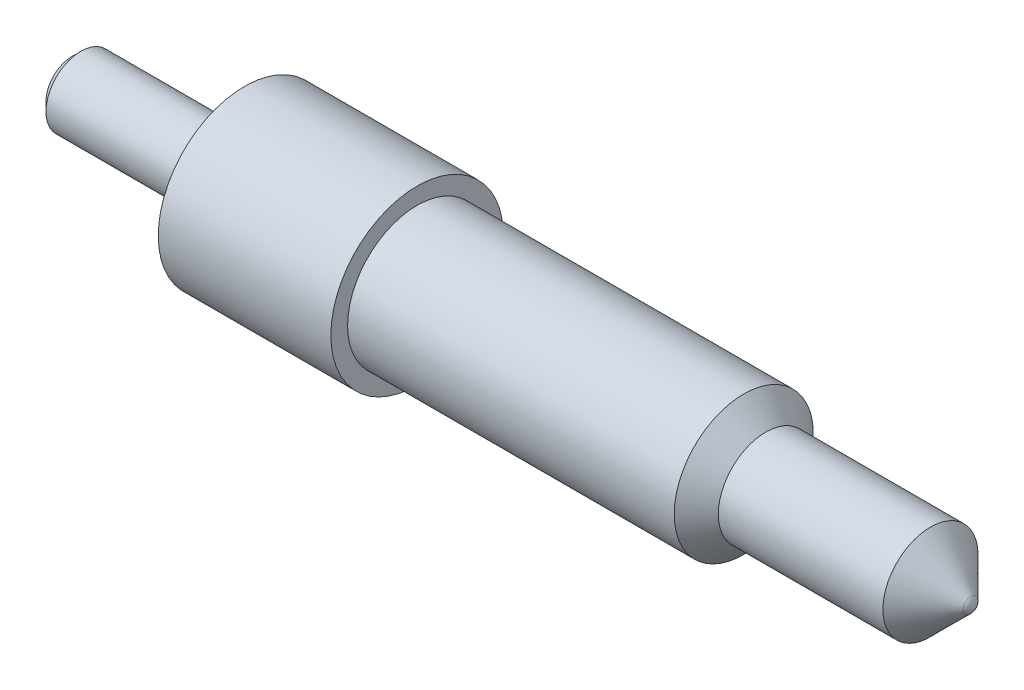
ISO-10303-21;
HEADER;
FILE_DESCRIPTION(('STEP AP214'),'2;1');
FILE_NAME('part.step','',(''),(''),'','','');
FILE_SCHEMA(('AUTOMOTIVE_DESIGN { 1 0 10303 214 1 1 1 1 }'));
ENDSEC;
DATA;
#1=APPLICATION_CONTEXT('core data for automotive mechanical design processes');
#2=APPLICATION_PROTOCOL_DEFINITION('international standard','automotive_design',2000,#1);
#3=PRODUCT_CONTEXT('',#1,'mechanical');
#4=PRODUCT('Part','Part','',(#3));
#5=PRODUCT_RELATED_PRODUCT_CATEGORY('part','',(#4));
#6=PRODUCT_DEFINITION_FORMATION('','',#4);
#7=PRODUCT_DEFINITION_CONTEXT('part definition',#1,'design');
#8=PRODUCT_DEFINITION('design','',#6,#7);
#9=PRODUCT_DEFINITION_SHAPE('','',#8);
#10=(LENGTH_UNIT() NAMED_UNIT(*) SI_UNIT(.MILLI.,.METRE.));
#11=(NAMED_UNIT(*) PLANE_ANGLE_UNIT() SI_UNIT($,.RADIAN.));
#12=(NAMED_UNIT(*) SI_UNIT($,.STERADIAN.) SOLID_ANGLE_UNIT());
#13=UNCERTAINTY_MEASURE_WITH_UNIT(LENGTH_MEASURE(1.E-05),#10,'distance_accuracy_value','');
#14=(GEOMETRIC_REPRESENTATION_CONTEXT(3) GLOBAL_UNCERTAINTY_ASSIGNED_CONTEXT((#13)) GLOBAL_UNIT_ASSIGNED_CONTEXT((#10,
#11,#12)) REPRESENTATION_CONTEXT('',''));
#15=CARTESIAN_POINT('',(0.,0.,0.));
#16=DIRECTION('',(0.,0.,1.));
#17=DIRECTION('',(1.,0.,0.));
#18=AXIS2_PLACEMENT_3D('',#15,#16,#17);
#19=CARTESIAN_POINT('',(12.8524,0.,0.));
#20=DIRECTION('',(-1.,0.,0.));
#21=DIRECTION('',(0.,1.,0.));
#22=AXIS2_PLACEMENT_3D('',#19,#20,#21);
#23=SPHERICAL_SURFACE('',#22,0.152399999999999);
#24=CARTESIAN_POINT('',(12.9601630734528,0.,0.));
#25=DIRECTION('',(-1.,0.,0.));
#26=DIRECTION('',(0.,0.,1.));
#27=AXIS2_PLACEMENT_3D('',#24,#25,#26);
#28=CIRCLE('',#27,0.107763073452829);
#29=CARTESIAN_POINT('',(12.9601630734528,0.,0.107763073452828));
#30=VERTEX_POINT('',#29);
#31=EDGE_CURVE('E10',#30,#30,#28,.T.);
#32=ORIENTED_EDGE('',*,*,#31,.F.);
#33=EDGE_LOOP('',(#32));
#34=FACE_BOUND('',#33,.T.);
#35=ADVANCED_FACE('F29',(#34),#23,.T.);
#36=CARTESIAN_POINT('',(12.9601630734528,0.,0.));
#37=DIRECTION('',(-1.,0.,0.));
#38=DIRECTION('',(0.,0.,1.));
#39=AXIS2_PLACEMENT_3D('',#36,#37,#38);
#40=CONICAL_SURFACE('',#39,0.107763073452829,0.785398163397447);
#41=CARTESIAN_POINT('',(12.3821261469057,0.,0.));
#42=DIRECTION('',(-1.,0.,0.));
#43=DIRECTION('',(0.,0.,1.));
#44=AXIS2_PLACEMENT_3D('',#41,#42,#43);
#45=CIRCLE('',#44,0.6858);
#46=CARTESIAN_POINT('',(12.3821261469057,0.,0.685799999999999));
#47=VERTEX_POINT('',#46);
#48=EDGE_CURVE('E35',#47,#47,#45,.T.);
#49=CARTESIAN_POINT('',(12.3821261469057,0.,0.685799999999999));
#50=CARTESIAN_POINT('',(12.3881473648905,0.,0.679778782015133));
#51=CARTESIAN_POINT('',(12.3941685828754,0.,0.673757564030266));
#52=CARTESIAN_POINT('',(12.4062110188451,0.,0.661715128060534));
#53=CARTESIAN_POINT('',(12.41223223683,0.,0.655693910075667));
#54=CARTESIAN_POINT('',(12.4242746727997,0.,0.643651474105935));
#55=CARTESIAN_POINT('',(12.4302958907846,0.,0.637630256121068));
#56=CARTESIAN_POINT('',(12.4423383267543,0.,0.625587820151335));
#57=CARTESIAN_POINT('',(12.4483595447392,0.,0.619566602166469));
#58=CARTESIAN_POINT('',(12.4604019807089,0.,0.607524166196736));
#59=CARTESIAN_POINT('',(12.4664231986938,0.,0.60150294821187));
#60=CARTESIAN_POINT('',(12.4784656346635,0.,0.589460512242137));
#61=CARTESIAN_POINT('',(12.4844868526484,0.,0.583439294257271));
#62=CARTESIAN_POINT('',(12.4965292886181,0.,0.571396858287538));
#63=CARTESIAN_POINT('',(12.502550506603,0.,0.565375640302672));
#64=CARTESIAN_POINT('',(12.5145929425727,0.,0.553333204332939));
#65=CARTESIAN_POINT('',(12.5206141605576,0.,0.547311986348073));
#66=CARTESIAN_POINT('',(12.5326565965273,0.,0.53526955037834));
#67=CARTESIAN_POINT('',(12.5386778145122,0.,0.529248332393474));
#68=CARTESIAN_POINT('',(12.5507202504819,0.,0.517205896423741));
#69=CARTESIAN_POINT('',(12.5567414684668,0.,0.511184678438875));
#70=CARTESIAN_POINT('',(12.5687839044365,0.,0.499142242469142));
#71=CARTESIAN_POINT('',(12.5748051224214,0.,0.493121024484276));
#72=CARTESIAN_POINT('',(12.5868475583911,0.,0.481078588514543));
#73=CARTESIAN_POINT('',(12.592868776376,0.,0.475057370529676));
#74=CARTESIAN_POINT('',(12.6049112123457,0.,0.463014934559944));
#75=CARTESIAN_POINT('',(12.6109324303306,0.,0.456993716575077));
#76=CARTESIAN_POINT('',(12.6229748663003,0.,0.444951280605345));
#77=CARTESIAN_POINT('',(12.6289960842852,0.,0.438930062620478));
#78=CARTESIAN_POINT('',(12.6410385202549,0.,0.426887626650745));
#79=CARTESIAN_POINT('',(12.6470597382398,0.,0.420866408665879));
#80=CARTESIAN_POINT('',(12.6591021742095,0.,0.408823972696146));
#81=CARTESIAN_POINT('',(12.6651233921944,0.,0.40280275471128));
#82=CARTESIAN_POINT('',(12.6771658281641,0.,0.390760318741547));
#83=CARTESIAN_POINT('',(12.683187046149,0.,0.384739100756681));
#84=CARTESIAN_POINT('',(12.6952294821187,0.,0.372696664786948));
#85=CARTESIAN_POINT('',(12.7012507001036,0.,0.366675446802082));
#86=CARTESIAN_POINT('',(12.7132931360733,0.,0.354633010832349));
#87=CARTESIAN_POINT('',(12.7193143540582,0.,0.348611792847483));
#88=CARTESIAN_POINT('',(12.7313567900279,0.,0.33656935687775));
#89=CARTESIAN_POINT('',(12.7373780080128,0.,0.330548138892884));
#90=CARTESIAN_POINT('',(12.7494204439825,0.,0.318505702923151));
#91=CARTESIAN_POINT('',(12.7554416619674,0.,0.312484484938285));
#92=CARTESIAN_POINT('',(12.7674840979371,0.,0.300442048968552));
#93=CARTESIAN_POINT('',(12.773505315922,0.,0.294420830983685));
#94=CARTESIAN_POINT('',(12.7855477518917,0.,0.282378395013953));
#95=CARTESIAN_POINT('',(12.7915689698766,0.,0.276357177029086));
#96=CARTESIAN_POINT('',(12.8036114058463,0.,0.264314741059354));
#97=CARTESIAN_POINT('',(12.8096326238312,0.,0.258293523074487));
#98=CARTESIAN_POINT('',(12.8216750598009,0.,0.246251087104755));
#99=CARTESIAN_POINT('',(12.8276962777858,0.,0.240229869119888));
#100=CARTESIAN_POINT('',(12.8397387137555,0.,0.228187433150155));
#101=CARTESIAN_POINT('',(12.8457599317404,0.,0.222166215165289));
#102=CARTESIAN_POINT('',(12.8578023677101,0.,0.210123779195556));
#103=CARTESIAN_POINT('',(12.863823585695,0.,0.20410256121069));
#104=CARTESIAN_POINT('',(12.8758660216647,0.,0.192060125240957));
#105=CARTESIAN_POINT('',(12.8818872396496,0.,0.186038907256091));
#106=CARTESIAN_POINT('',(12.8939296756193,0.,0.173996471286358));
#107=CARTESIAN_POINT('',(12.8999508936042,0.,0.167975253301492));
#108=CARTESIAN_POINT('',(12.9119933295739,0.,0.155932817331759));
#109=CARTESIAN_POINT('',(12.9180145475588,0.,0.149911599346893));
#110=CARTESIAN_POINT('',(12.9300569835285,0.,0.13786916337716));
#111=CARTESIAN_POINT('',(12.9360782015134,0.,0.131847945392294));
#112=CARTESIAN_POINT('',(12.9481206374831,0.,0.119805509422561));
#113=CARTESIAN_POINT('',(12.954141855468,0.,0.113784291437695));
#114=CARTESIAN_POINT('',(12.9601630734528,0.,0.107763073452828));
#115=B_SPLINE_CURVE_WITH_KNOTS('',3,(#49,#50,#51,#52,#53,#54,#55,#56,#57,#58,#59,#60,#61,#62,
#63,#64,#65,#66,#67,#68,#69,#70,#71,#72,#73,#74,#75,#76,#77,#78,#79,#80,#81,#82,#83,#84,#85,#86,
#87,#88,#89,#90,#91,#92,#93,#94,#95,#96,#97,#98,#99,#100,#101,#102,#103,#104,#105,#106,#107,
#108,#109,#110,#111,#112,#113,#114),.UNSPECIFIED.,.F.,.F.,(4,2,2,2,2,2,2,2,2,2,2,2,2,2,2,2,2,2,
2,2,2,2,2,2,2,2,2,2,2,2,2,2,4),(0.,0.0255458644086085,0.0510917288172171,0.0766375932258256,
0.102183457634434,0.127729322043043,0.153275186451651,0.17882105086026,0.204366915268868,
0.229912779677477,0.255458644086085,0.281004508494694,0.306550372903303,0.332096237311911,
0.35764210172052,0.383187966129128,0.408733830537737,0.434279694946344,0.459825559354953,
0.485371423763561,0.51091728817217,0.536463152580778,0.562009016989387,0.587554881397995,
0.613100745806604,0.638646610215213,0.664192474623821,0.68973833903243,0.715284203441038,
0.740830067849647,0.766375932258256,0.791921796666864,0.817467661075471),.UNSPECIFIED.);
#116=EDGE_CURVE('BSEAM113',#47,#30,#115,.T.);
#117=ORIENTED_EDGE('',*,*,#48,.F.);
#118=ORIENTED_EDGE('',*,*,#31,.T.);
#119=ORIENTED_EDGE('',*,*,#116,.T.);
#120=ORIENTED_EDGE('',*,*,#116,.F.);
#121=EDGE_LOOP('',(#117,#119,#118,#120));
#122=FACE_BOUND('',#121,.T.);
#123=ADVANCED_FACE('F113',(#122),#40,.T.);
#124=CARTESIAN_POINT('',(-3.44790704990662,0.,0.));
#125=DIRECTION('',(-1.,0.,0.));
#126=DIRECTION('',(0.,0.,1.));
#127=AXIS2_PLACEMENT_3D('',#124,#125,#126);
#128=CYLINDRICAL_SURFACE('',#127,0.6858);
#129=CARTESIAN_POINT('',(10.0076,0.,0.));
#130=DIRECTION('',(-1.,0.,0.));
#131=DIRECTION('',(0.,0.,1.));
#132=AXIS2_PLACEMENT_3D('',#129,#130,#131);
#133=CIRCLE('',#132,0.6858);
#134=CARTESIAN_POINT('',(10.0076,0.,0.6858));
#135=VERTEX_POINT('',#134);
#136=EDGE_CURVE('E39',#135,#135,#133,.T.);
#137=ORIENTED_EDGE('',*,*,#136,.F.);
#138=EDGE_LOOP('',(#137));
#139=FACE_BOUND('',#138,.T.);
#140=ORIENTED_EDGE('',*,*,#48,.T.);
#141=EDGE_LOOP('',(#140));
#142=FACE_BOUND('',#141,.T.);
#143=ADVANCED_FACE('F108',(#139,#142),#128,.T.);
#144=CARTESIAN_POINT('',(10.0076,0.,0.));
#145=DIRECTION('',(-1.,0.,0.));
#146=DIRECTION('',(0.,0.,1.));
#147=AXIS2_PLACEMENT_3D('',#144,#145,#146);
#148=CONICAL_SURFACE('',#147,0.6858,0.785398163397448);
#149=CARTESIAN_POINT('',(9.6901,0.,0.));
#150=DIRECTION('',(-1.,0.,0.));
#151=DIRECTION('',(0.,0.,1.));
#152=AXIS2_PLACEMENT_3D('',#149,#150,#151);
#153=CIRCLE('',#152,1.0033);
#154=CARTESIAN_POINT('',(9.6901,0.,1.0033));
#155=VERTEX_POINT('',#154);
#156=EDGE_CURVE('E43',#155,#155,#153,.T.);
#157=ORIENTED_EDGE('',*,*,#156,.F.);
#158=EDGE_LOOP('',(#157));
#159=FACE_BOUND('',#158,.T.);
#160=ORIENTED_EDGE('',*,*,#136,.T.);
#161=EDGE_LOOP('',(#160));
#162=FACE_BOUND('',#161,.T.);
#163=ADVANCED_FACE('F102',(#159,#162),#148,.T.);
#164=CARTESIAN_POINT('',(-3.44790704990662,0.,0.));
#165=DIRECTION('',(-1.,0.,0.));
#166=DIRECTION('',(0.,0.,1.));
#167=AXIS2_PLACEMENT_3D('',#164,#165,#166);
#168=CYLINDRICAL_SURFACE('',#167,1.0033);
#169=CARTESIAN_POINT('',(4.9784,0.,0.));
#170=DIRECTION('',(-1.,0.,0.));
#171=DIRECTION('',(0.,0.,1.));
#172=AXIS2_PLACEMENT_3D('',#169,#170,#171);
#173=CIRCLE('',#172,1.0033);
#174=CARTESIAN_POINT('',(4.9784,0.,1.0033));
#175=VERTEX_POINT('',#174);
#176=EDGE_CURVE('E48',#175,#175,#173,.T.);
#177=ORIENTED_EDGE('',*,*,#176,.F.);
#178=EDGE_LOOP('',(#177));
#179=FACE_BOUND('',#178,.T.);
#180=ORIENTED_EDGE('',*,*,#156,.T.);
#181=EDGE_LOOP('',(#180));
#182=FACE_BOUND('',#181,.T.);
#183=ADVANCED_FACE('F96',(#179,#182),#168,.T.);
#184=CARTESIAN_POINT('',(4.9784,1.2446,0.));
#185=DIRECTION('',(-1.,0.,0.));
#186=DIRECTION('',(0.,0.,1.));
#187=AXIS2_PLACEMENT_3D('',#184,#185,#186);
#188=PLANE('',#187);
#189=CARTESIAN_POINT('',(4.9784,0.,0.));
#190=DIRECTION('',(-1.,0.,0.));
#191=DIRECTION('',(0.,0.,1.));
#192=AXIS2_PLACEMENT_3D('',#189,#190,#191);
#193=CIRCLE('',#192,1.2446);
#194=CARTESIAN_POINT('',(4.9784,0.,1.2446));
#195=VERTEX_POINT('',#194);
#196=EDGE_CURVE('E51',#195,#195,#193,.T.);
#197=ORIENTED_EDGE('',*,*,#196,.F.);
#198=EDGE_LOOP('',(#197));
#199=FACE_BOUND('',#198,.T.);
#200=ORIENTED_EDGE('',*,*,#176,.T.);
#201=EDGE_LOOP('',(#200));
#202=FACE_BOUND('',#201,.T.);
#203=ADVANCED_FACE('F90',(#199,#202),#188,.F.);
#204=CARTESIAN_POINT('',(-3.44790704990662,0.,0.));
#205=DIRECTION('',(-1.,0.,0.));
#206=DIRECTION('',(0.,0.,1.));
#207=AXIS2_PLACEMENT_3D('',#204,#205,#206);
#208=CYLINDRICAL_SURFACE('',#207,1.2446);
#209=CARTESIAN_POINT('',(2.4892,0.,0.));
#210=DIRECTION('',(-1.,0.,0.));
#211=DIRECTION('',(0.,0.,1.));
#212=AXIS2_PLACEMENT_3D('',#209,#210,#211);
#213=CIRCLE('',#212,1.2446);
#214=CARTESIAN_POINT('',(2.4892,0.,1.2446));
#215=VERTEX_POINT('',#214);
#216=EDGE_CURVE('E54',#215,#215,#213,.T.);
#217=ORIENTED_EDGE('',*,*,#216,.F.);
#218=EDGE_LOOP('',(#217));
#219=FACE_BOUND('',#218,.T.);
#220=ORIENTED_EDGE('',*,*,#196,.T.);
#221=EDGE_LOOP('',(#220));
#222=FACE_BOUND('',#221,.T.);
#223=ADVANCED_FACE('F84',(#219,#222),#208,.T.);
#224=CARTESIAN_POINT('',(2.4892,0.50165,0.));
#225=DIRECTION('',(1.,0.,0.));
#226=DIRECTION('',(0.,0.,-1.));
#227=AXIS2_PLACEMENT_3D('',#224,#225,#226);
#228=PLANE('',#227);
#229=CARTESIAN_POINT('',(2.4892,0.,0.));
#230=DIRECTION('',(-1.,0.,0.));
#231=DIRECTION('',(0.,0.,1.));
#232=AXIS2_PLACEMENT_3D('',#229,#230,#231);
#233=CIRCLE('',#232,0.50165);
#234=CARTESIAN_POINT('',(2.4892,0.,0.50165));
#235=VERTEX_POINT('',#234);
#236=EDGE_CURVE('E57',#235,#235,#233,.T.);
#237=ORIENTED_EDGE('',*,*,#236,.F.);
#238=EDGE_LOOP('',(#237));
#239=FACE_BOUND('',#238,.T.);
#240=ORIENTED_EDGE('',*,*,#216,.T.);
#241=EDGE_LOOP('',(#240));
#242=FACE_BOUND('',#241,.T.);
#243=ADVANCED_FACE('F78',(#239,#242),#228,.F.);
#244=CARTESIAN_POINT('',(-3.44790704990662,0.,0.));
#245=DIRECTION('',(-1.,0.,0.));
#246=DIRECTION('',(0.,0.,1.));
#247=AXIS2_PLACEMENT_3D('',#244,#245,#246);
#248=CYLINDRICAL_SURFACE('',#247,0.50165);
#249=CARTESIAN_POINT('',(0.127,0.,0.));
#250=DIRECTION('',(-1.,0.,0.));
#251=DIRECTION('',(0.,0.,1.));
#252=AXIS2_PLACEMENT_3D('',#249,#250,#251);
#253=CIRCLE('',#252,0.50165);
#254=CARTESIAN_POINT('',(0.127,0.,0.50165));
#255=VERTEX_POINT('',#254);
#256=EDGE_CURVE('E60',#255,#255,#253,.T.);
#257=ORIENTED_EDGE('',*,*,#256,.F.);
#258=EDGE_LOOP('',(#257));
#259=FACE_BOUND('',#258,.T.);
#260=ORIENTED_EDGE('',*,*,#236,.T.);
#261=EDGE_LOOP('',(#260));
#262=FACE_BOUND('',#261,.T.);
#263=ADVANCED_FACE('F72',(#259,#262),#248,.T.);
#264=CARTESIAN_POINT('',(0.127,0.,0.));
#265=DIRECTION('',(1.,0.,0.));
#266=DIRECTION('',(0.,0.,-1.));
#267=AXIS2_PLACEMENT_3D('',#264,#265,#266);
#268=CONICAL_SURFACE('',#267,0.50165,0.78539816339745);
#269=CARTESIAN_POINT('',(0.,0.,0.));
#270=DIRECTION('',(-1.,0.,0.));
#271=DIRECTION('',(0.,0.,1.));
#272=AXIS2_PLACEMENT_3D('',#269,#270,#271);
#273=CIRCLE('',#272,0.37465);
#274=CARTESIAN_POINT('',(0.,0.,0.37465));
#275=VERTEX_POINT('',#274);
#276=EDGE_CURVE('E63',#275,#275,#273,.T.);
#277=ORIENTED_EDGE('',*,*,#276,.F.);
#278=EDGE_LOOP('',(#277));
#279=FACE_BOUND('',#278,.T.);
#280=ORIENTED_EDGE('',*,*,#256,.T.);
#281=EDGE_LOOP('',(#280));
#282=FACE_BOUND('',#281,.T.);
#283=ADVANCED_FACE('F69',(#279,#282),#268,.T.);
#284=CARTESIAN_POINT('',(0.,0.,0.));
#285=DIRECTION('',(1.,0.,0.));
#286=DIRECTION('',(0.,0.,-1.));
#287=AXIS2_PLACEMENT_3D('',#284,#285,#286);
#288=PLANE('',#287);
#289=ORIENTED_EDGE('',*,*,#276,.T.);
#290=EDGE_LOOP('',(#289));
#291=FACE_BOUND('',#290,.T.);
#292=ADVANCED_FACE('F67',(#291),#288,.F.);
#293=CLOSED_SHELL('',(#35,#123,#143,#163,#183,#203,#223,#243,#263,#283,#292));
#294=MANIFOLD_SOLID_BREP('B2',#293);
#295=ADVANCED_BREP_SHAPE_REPRESENTATION('',(#18,#294),#14);
#296=SHAPE_DEFINITION_REPRESENTATION(#9,#295);
ENDSEC;
END-ISO-10303-21;
